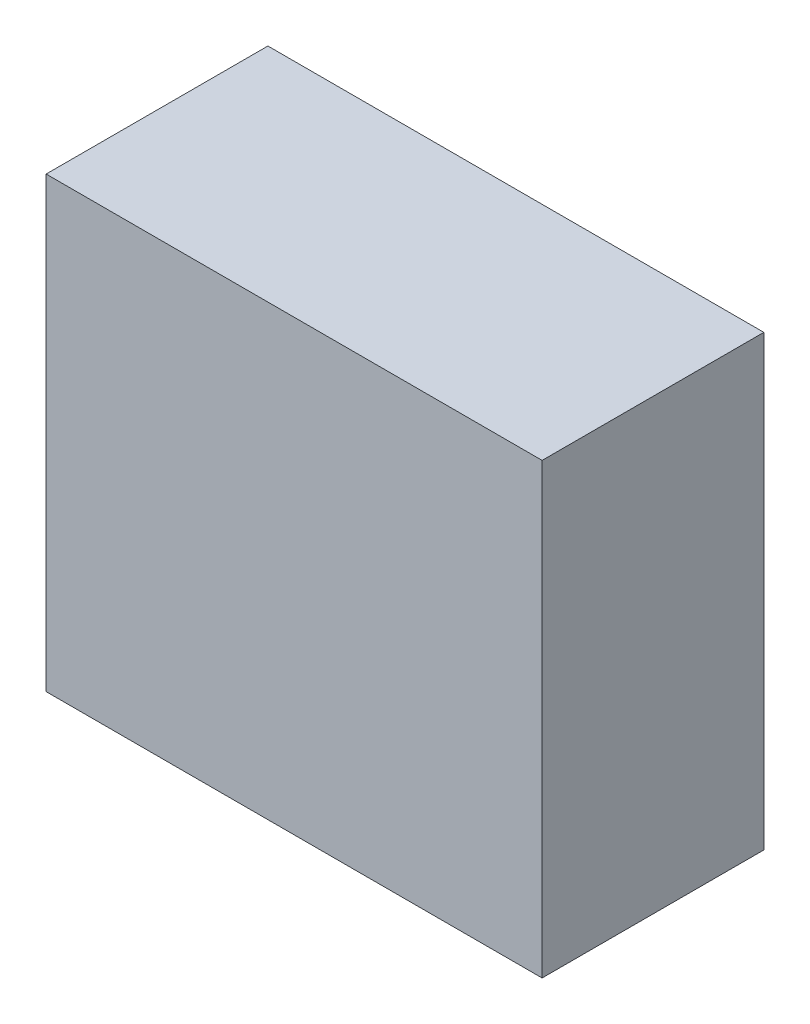
ISO-10303-21;
HEADER;
FILE_DESCRIPTION(('STEP AP214'),'2;1');
FILE_NAME('part.step','',(''),(''),'','','');
FILE_SCHEMA(('AUTOMOTIVE_DESIGN { 1 0 10303 214 1 1 1 1 }'));
ENDSEC;
DATA;
#1=APPLICATION_CONTEXT('core data for automotive mechanical design processes');
#2=APPLICATION_PROTOCOL_DEFINITION('international standard','automotive_design',2000,#1);
#3=PRODUCT_CONTEXT('',#1,'mechanical');
#4=PRODUCT('Part','Part','',(#3));
#5=PRODUCT_RELATED_PRODUCT_CATEGORY('part','',(#4));
#6=PRODUCT_DEFINITION_FORMATION('','',#4);
#7=PRODUCT_DEFINITION_CONTEXT('part definition',#1,'design');
#8=PRODUCT_DEFINITION('design','',#6,#7);
#9=PRODUCT_DEFINITION_SHAPE('','',#8);
#10=(LENGTH_UNIT() NAMED_UNIT(*) SI_UNIT(.MILLI.,.METRE.));
#11=(NAMED_UNIT(*) PLANE_ANGLE_UNIT() SI_UNIT($,.RADIAN.));
#12=(NAMED_UNIT(*) SI_UNIT($,.STERADIAN.) SOLID_ANGLE_UNIT());
#13=UNCERTAINTY_MEASURE_WITH_UNIT(LENGTH_MEASURE(1.E-05),#10,'distance_accuracy_value','');
#14=(GEOMETRIC_REPRESENTATION_CONTEXT(3) GLOBAL_UNCERTAINTY_ASSIGNED_CONTEXT((#13)) GLOBAL_UNIT_ASSIGNED_CONTEXT((#10,
#11,#12)) REPRESENTATION_CONTEXT('',''));
#15=CARTESIAN_POINT('',(0.,0.,0.));
#16=DIRECTION('',(0.,0.,1.));
#17=DIRECTION('',(1.,0.,0.));
#18=AXIS2_PLACEMENT_3D('',#15,#16,#17);
#19=CARTESIAN_POINT('',(5.19999976,-4.69999822,4.65000086));
#20=DIRECTION('',(0.,0.,1.));
#21=DIRECTION('',(1.,0.,0.));
#22=AXIS2_PLACEMENT_3D('',#19,#20,#21);
#23=PLANE('',#22);
#24=DIRECTION('',(0.,1.,0.));
#25=VECTOR('',#24,1.);
#26=CARTESIAN_POINT('',(-5.19999976,-4.69999822,4.65000086));
#27=LINE('',#26,#25);
#28=CARTESIAN_POINT('',(-5.19999976,-4.69999822,4.65000086));
#29=VERTEX_POINT('',#28);
#30=CARTESIAN_POINT('',(-5.19999976,4.70000076,4.65000086));
#31=VERTEX_POINT('',#30);
#32=EDGE_CURVE('E53',#29,#31,#27,.T.);
#33=ORIENTED_EDGE('',*,*,#32,.F.);
#34=DIRECTION('',(1.,0.,0.));
#35=VECTOR('',#34,1.);
#36=CARTESIAN_POINT('',(5.19999976,-4.69999822,4.65000086));
#37=LINE('',#36,#35);
#38=CARTESIAN_POINT('',(5.19999976,-4.69999822,4.65000086));
#39=VERTEX_POINT('',#38);
#40=EDGE_CURVE('E68',#39,#29,#37,.F.);
#41=ORIENTED_EDGE('',*,*,#40,.F.);
#42=DIRECTION('',(0.,1.,0.));
#43=VECTOR('',#42,1.);
#44=CARTESIAN_POINT('',(5.19999976,4.70000076,4.65000086));
#45=LINE('',#44,#43);
#46=CARTESIAN_POINT('',(5.19999976,4.70000076,4.65000086));
#47=VERTEX_POINT('',#46);
#48=EDGE_CURVE('E20',#47,#39,#45,.F.);
#49=ORIENTED_EDGE('',*,*,#48,.F.);
#50=DIRECTION('',(1.,0.,0.));
#51=VECTOR('',#50,1.);
#52=CARTESIAN_POINT('',(-5.19999976,4.70000076,4.65000086));
#53=LINE('',#52,#51);
#54=EDGE_CURVE('E58',#31,#47,#53,.T.);
#55=ORIENTED_EDGE('',*,*,#54,.F.);
#56=EDGE_LOOP('',(#33,#41,#49,#55));
#57=FACE_BOUND('',#56,.T.);
#58=ADVANCED_FACE('F17',(#57),#23,.T.);
#59=CARTESIAN_POINT('',(5.19999976,4.70000076,0.));
#60=DIRECTION('',(1.,0.,0.));
#61=DIRECTION('',(0.,0.,-1.));
#62=AXIS2_PLACEMENT_3D('',#59,#60,#61);
#63=PLANE('',#62);
#64=DIRECTION('',(0.,0.,-1.));
#65=VECTOR('',#64,1.);
#66=CARTESIAN_POINT('',(5.19999976,-4.69999822,0.));
#67=LINE('',#66,#65);
#68=CARTESIAN_POINT('',(5.19999976,-4.69999822,0.));
#69=VERTEX_POINT('',#68);
#70=EDGE_CURVE('E79',#69,#39,#67,.F.);
#71=ORIENTED_EDGE('',*,*,#70,.F.);
#72=DIRECTION('',(0.,1.,0.));
#73=VECTOR('',#72,1.);
#74=CARTESIAN_POINT('',(5.19999976,-4.69999822,0.));
#75=LINE('',#74,#73);
#76=CARTESIAN_POINT('',(5.19999976,4.70000076,0.));
#77=VERTEX_POINT('',#76);
#78=EDGE_CURVE('E74',#69,#77,#75,.T.);
#79=ORIENTED_EDGE('',*,*,#78,.T.);
#80=DIRECTION('',(0.,0.,1.));
#81=VECTOR('',#80,1.);
#82=CARTESIAN_POINT('',(5.19999976,4.70000076,0.));
#83=LINE('',#82,#81);
#84=EDGE_CURVE('E63',#47,#77,#83,.F.);
#85=ORIENTED_EDGE('',*,*,#84,.F.);
#86=ORIENTED_EDGE('',*,*,#48,.T.);
#87=EDGE_LOOP('',(#71,#79,#85,#86));
#88=FACE_BOUND('',#87,.T.);
#89=ADVANCED_FACE('F73',(#88),#63,.T.);
#90=CARTESIAN_POINT('',(-5.19999976,4.70000076,0.));
#91=DIRECTION('',(0.,1.,0.));
#92=DIRECTION('',(0.,0.,1.));
#93=AXIS2_PLACEMENT_3D('',#90,#91,#92);
#94=PLANE('',#93);
#95=ORIENTED_EDGE('',*,*,#84,.T.);
#96=DIRECTION('',(1.,0.,0.));
#97=VECTOR('',#96,1.);
#98=CARTESIAN_POINT('',(5.19999976,4.70000076,0.));
#99=LINE('',#98,#97);
#100=CARTESIAN_POINT('',(-5.19999976,4.70000076,0.));
#101=VERTEX_POINT('',#100);
#102=EDGE_CURVE('E84',#77,#101,#99,.F.);
#103=ORIENTED_EDGE('',*,*,#102,.T.);
#104=DIRECTION('',(0.,0.,1.));
#105=VECTOR('',#104,1.);
#106=CARTESIAN_POINT('',(-5.19999976,4.70000076,0.));
#107=LINE('',#106,#105);
#108=EDGE_CURVE('E65',#31,#101,#107,.F.);
#109=ORIENTED_EDGE('',*,*,#108,.F.);
#110=ORIENTED_EDGE('',*,*,#54,.T.);
#111=EDGE_LOOP('',(#95,#103,#109,#110));
#112=FACE_BOUND('',#111,.T.);
#113=ADVANCED_FACE('F60',(#112),#94,.T.);
#114=CARTESIAN_POINT('',(-5.19999976,-4.69999822,0.));
#115=DIRECTION('',(-1.,0.,0.));
#116=DIRECTION('',(0.,0.,1.));
#117=AXIS2_PLACEMENT_3D('',#114,#115,#116);
#118=PLANE('',#117);
#119=ORIENTED_EDGE('',*,*,#108,.T.);
#120=DIRECTION('',(0.,1.,0.));
#121=VECTOR('',#120,1.);
#122=CARTESIAN_POINT('',(-5.19999976,-4.69999822,0.));
#123=LINE('',#122,#121);
#124=CARTESIAN_POINT('',(-5.19999976,-4.69999822,0.));
#125=VERTEX_POINT('',#124);
#126=EDGE_CURVE('E26',#101,#125,#123,.F.);
#127=ORIENTED_EDGE('',*,*,#126,.T.);
#128=DIRECTION('',(0.,0.,-1.));
#129=VECTOR('',#128,1.);
#130=CARTESIAN_POINT('',(-5.19999976,-4.69999822,0.));
#131=LINE('',#130,#129);
#132=EDGE_CURVE('E34',#29,#125,#131,.T.);
#133=ORIENTED_EDGE('',*,*,#132,.F.);
#134=ORIENTED_EDGE('',*,*,#32,.T.);
#135=EDGE_LOOP('',(#119,#127,#133,#134));
#136=FACE_BOUND('',#135,.T.);
#137=ADVANCED_FACE('F88',(#136),#118,.T.);
#138=CARTESIAN_POINT('',(5.19999976,-4.69999822,0.));
#139=DIRECTION('',(0.,-1.,0.));
#140=DIRECTION('',(0.,0.,-1.));
#141=AXIS2_PLACEMENT_3D('',#138,#139,#140);
#142=PLANE('',#141);
#143=ORIENTED_EDGE('',*,*,#132,.T.);
#144=DIRECTION('',(1.,0.,0.));
#145=VECTOR('',#144,1.);
#146=CARTESIAN_POINT('',(5.19999976,-4.69999822,0.));
#147=LINE('',#146,#145);
#148=EDGE_CURVE('E11',#125,#69,#147,.T.);
#149=ORIENTED_EDGE('',*,*,#148,.T.);
#150=ORIENTED_EDGE('',*,*,#70,.T.);
#151=ORIENTED_EDGE('',*,*,#40,.T.);
#152=EDGE_LOOP('',(#143,#149,#150,#151));
#153=FACE_BOUND('',#152,.T.);
#154=ADVANCED_FACE('F91',(#153),#142,.T.);
#155=CARTESIAN_POINT('',(5.19999976,-4.69999822,0.));
#156=DIRECTION('',(0.,0.,1.));
#157=DIRECTION('',(1.,0.,0.));
#158=AXIS2_PLACEMENT_3D('',#155,#156,#157);
#159=PLANE('',#158);
#160=ORIENTED_EDGE('',*,*,#126,.F.);
#161=ORIENTED_EDGE('',*,*,#102,.F.);
#162=ORIENTED_EDGE('',*,*,#78,.F.);
#163=ORIENTED_EDGE('',*,*,#148,.F.);
#164=EDGE_LOOP('',(#160,#161,#162,#163));
#165=FACE_BOUND('',#164,.T.);
#166=ADVANCED_FACE('F90',(#165),#159,.F.);
#167=CLOSED_SHELL('',(#58,#89,#113,#137,#154,#166));
#168=MANIFOLD_SOLID_BREP('B1',#167);
#169=ADVANCED_BREP_SHAPE_REPRESENTATION('',(#18,#168),#14);
#170=SHAPE_DEFINITION_REPRESENTATION(#9,#169);
ENDSEC;
END-ISO-10303-21;
